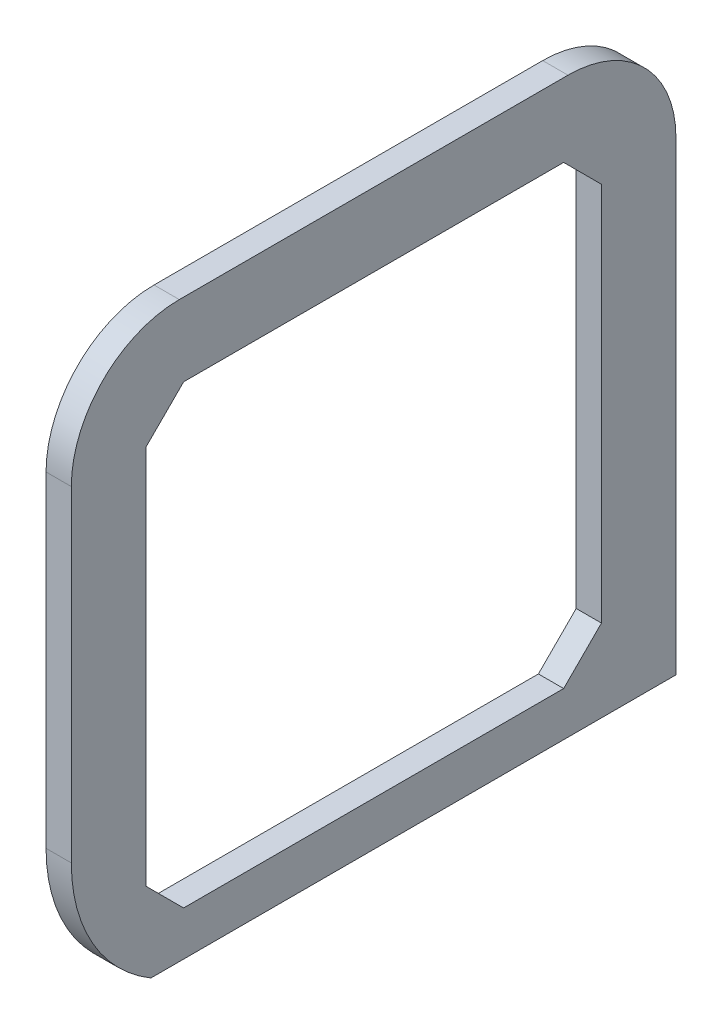
ISO-10303-21;
HEADER;
FILE_DESCRIPTION(('STEP AP214'),'2;1');
FILE_NAME('part.step','',(''),(''),'','','');
FILE_SCHEMA(('AUTOMOTIVE_DESIGN { 1 0 10303 214 1 1 1 1 }'));
ENDSEC;
DATA;
#1=APPLICATION_CONTEXT('core data for automotive mechanical design processes');
#2=APPLICATION_PROTOCOL_DEFINITION('international standard','automotive_design',2000,#1);
#3=PRODUCT_CONTEXT('',#1,'mechanical');
#4=PRODUCT('Part','Part','',(#3));
#5=PRODUCT_RELATED_PRODUCT_CATEGORY('part','',(#4));
#6=PRODUCT_DEFINITION_FORMATION('','',#4);
#7=PRODUCT_DEFINITION_CONTEXT('part definition',#1,'design');
#8=PRODUCT_DEFINITION('design','',#6,#7);
#9=PRODUCT_DEFINITION_SHAPE('','',#8);
#10=(LENGTH_UNIT() NAMED_UNIT(*) SI_UNIT(.MILLI.,.METRE.));
#11=(NAMED_UNIT(*) PLANE_ANGLE_UNIT() SI_UNIT($,.RADIAN.));
#12=(NAMED_UNIT(*) SI_UNIT($,.STERADIAN.) SOLID_ANGLE_UNIT());
#13=UNCERTAINTY_MEASURE_WITH_UNIT(LENGTH_MEASURE(1.E-05),#10,'distance_accuracy_value','');
#14=(GEOMETRIC_REPRESENTATION_CONTEXT(3) GLOBAL_UNCERTAINTY_ASSIGNED_CONTEXT((#13)) GLOBAL_UNIT_ASSIGNED_CONTEXT((#10,
#11,#12)) REPRESENTATION_CONTEXT('',''));
#15=CARTESIAN_POINT('',(0.,0.,0.));
#16=DIRECTION('',(0.,0.,1.));
#17=DIRECTION('',(1.,0.,0.));
#18=AXIS2_PLACEMENT_3D('',#15,#16,#17);
#19=CARTESIAN_POINT('',(17.7,-7.94174180000014,56.));
#20=DIRECTION('',(-1.,0.,0.));
#21=DIRECTION('',(0.,0.,1.));
#22=AXIS2_PLACEMENT_3D('',#19,#20,#21);
#23=PLANE('',#22);
#24=DIRECTION('',(0.,0.,-1.));
#25=VECTOR('',#24,1.);
#26=CARTESIAN_POINT('',(17.7,21.0200000000001,49.1));
#27=LINE('',#26,#25);
#28=CARTESIAN_POINT('',(17.7,21.0200000000001,45.6));
#29=VERTEX_POINT('',#28);
#30=CARTESIAN_POINT('',(17.7,21.0200000000001,10.4));
#31=VERTEX_POINT('',#30);
#32=EDGE_CURVE('E218',#29,#31,#27,.T.);
#33=ORIENTED_EDGE('',*,*,#32,.F.);
#34=DIRECTION('',(0.,-0.707106781186548,-0.707106781186548));
#35=VECTOR('',#34,1.);
#36=CARTESIAN_POINT('',(17.7,11.7391291,36.3191290999999));
#37=LINE('',#36,#35);
#38=CARTESIAN_POINT('',(17.7,24.5200000000001,49.1));
#39=VERTEX_POINT('',#38);
#40=EDGE_CURVE('E270',#29,#39,#37,.F.);
#41=ORIENTED_EDGE('',*,*,#40,.T.);
#42=DIRECTION('',(0.,-1.,0.));
#43=VECTOR('',#42,1.);
#44=CARTESIAN_POINT('',(17.7,21.0200000000001,49.1));
#45=LINE('',#44,#43);
#46=CARTESIAN_POINT('',(17.7,59.7200000000001,49.1));
#47=VERTEX_POINT('',#46);
#48=EDGE_CURVE('E214',#47,#39,#45,.T.);
#49=ORIENTED_EDGE('',*,*,#48,.F.);
#50=DIRECTION('',(0.,-0.707106781186548,0.707106781186548));
#51=VECTOR('',#50,1.);
#52=CARTESIAN_POINT('',(17.7,22.4391291,86.3808709000001));
#53=LINE('',#52,#51);
#54=CARTESIAN_POINT('',(17.7,63.2200000000001,45.6));
#55=VERTEX_POINT('',#54);
#56=EDGE_CURVE('E276',#47,#55,#53,.F.);
#57=ORIENTED_EDGE('',*,*,#56,.T.);
#58=DIRECTION('',(0.,0.,1.));
#59=VECTOR('',#58,1.);
#60=CARTESIAN_POINT('',(17.7,63.2200000000001,49.1));
#61=LINE('',#60,#59);
#62=CARTESIAN_POINT('',(17.7,63.2200000000001,10.4));
#63=VERTEX_POINT('',#62);
#64=EDGE_CURVE('E226',#63,#55,#61,.T.);
#65=ORIENTED_EDGE('',*,*,#64,.F.);
#66=DIRECTION('',(0.,0.707106781186547,0.707106781186548));
#67=VECTOR('',#66,1.);
#68=CARTESIAN_POINT('',(17.7,50.4391291,-2.3808709000001));
#69=LINE('',#68,#67);
#70=CARTESIAN_POINT('',(17.7,59.7200000000001,6.9));
#71=VERTEX_POINT('',#70);
#72=EDGE_CURVE('E273',#63,#71,#69,.F.);
#73=ORIENTED_EDGE('',*,*,#72,.T.);
#74=DIRECTION('',(0.,1.,0.));
#75=VECTOR('',#74,1.);
#76=CARTESIAN_POINT('',(17.7,21.0200000000001,6.89999999999999));
#77=LINE('',#76,#75);
#78=CARTESIAN_POINT('',(17.7,24.5200000000001,6.89999999999999));
#79=VERTEX_POINT('',#78);
#80=EDGE_CURVE('E222',#79,#71,#77,.T.);
#81=ORIENTED_EDGE('',*,*,#80,.F.);
#82=DIRECTION('',(0.,0.707106781186548,-0.707106781186547));
#83=VECTOR('',#82,1.);
#84=CARTESIAN_POINT('',(17.7,-16.2608709,47.6808709000001));
#85=LINE('',#84,#83);
#86=EDGE_CURVE('E267',#79,#31,#85,.F.);
#87=ORIENTED_EDGE('',*,*,#86,.T.);
#88=EDGE_LOOP('',(#33,#41,#49,#57,#65,#73,#81,#87));
#89=FACE_BOUND('',#88,.T.);
#90=CARTESIAN_POINT('',(17.7,29.8312064500954,41.));
#91=DIRECTION('',(-1.,0.,0.));
#92=DIRECTION('',(0.,0.,1.));
#93=AXIS2_PLACEMENT_3D('',#90,#91,#92);
#94=CIRCLE('',#93,15.);
#95=CARTESIAN_POINT('',(17.7,29.8312064500954,56.));
#96=VERTEX_POINT('',#95);
#97=CARTESIAN_POINT('',(17.7,16.914250509231,48.6257622059548));
#98=VERTEX_POINT('',#97);
#99=EDGE_CURVE('E303',#96,#98,#94,.F.);
#100=ORIENTED_EDGE('',*,*,#99,.T.);
#101=DIRECTION('',(0.,0.,-1.));
#102=VECTOR('',#101,1.);
#103=CARTESIAN_POINT('',(17.7,16.914250509231,56.));
#104=LINE('',#103,#102);
#105=CARTESIAN_POINT('',(17.7,16.914250509231,0.));
#106=VERTEX_POINT('',#105);
#107=EDGE_CURVE('E65',#98,#106,#104,.T.);
#108=ORIENTED_EDGE('',*,*,#107,.T.);
#109=DIRECTION('',(0.,1.,0.));
#110=VECTOR('',#109,1.);
#111=CARTESIAN_POINT('',(17.7,-7.94174180000014,0.));
#112=LINE('',#111,#110);
#113=CARTESIAN_POINT('',(17.7,60.0200000000001,0.));
#114=VERTEX_POINT('',#113);
#115=EDGE_CURVE('E168',#106,#114,#112,.T.);
#116=ORIENTED_EDGE('',*,*,#115,.T.);
#117=CARTESIAN_POINT('',(17.7,60.0200000000001,10.));
#118=DIRECTION('',(-1.,0.,0.));
#119=DIRECTION('',(0.,0.,1.));
#120=AXIS2_PLACEMENT_3D('',#117,#118,#119);
#121=CIRCLE('',#120,10.);
#122=CARTESIAN_POINT('',(17.7,70.0200000000001,10.));
#123=VERTEX_POINT('',#122);
#124=EDGE_CURVE('E286',#114,#123,#121,.F.);
#125=ORIENTED_EDGE('',*,*,#124,.T.);
#126=DIRECTION('',(0.,0.,-1.));
#127=VECTOR('',#126,1.);
#128=CARTESIAN_POINT('',(17.7,70.0200000000001,56.));
#129=LINE('',#128,#127);
#130=CARTESIAN_POINT('',(17.7,70.0200000000001,46.));
#131=VERTEX_POINT('',#130);
#132=EDGE_CURVE('E233',#131,#123,#129,.T.);
#133=ORIENTED_EDGE('',*,*,#132,.F.);
#134=CARTESIAN_POINT('',(17.7,60.0200000000001,46.));
#135=DIRECTION('',(-1.,0.,0.));
#136=DIRECTION('',(0.,0.,1.));
#137=AXIS2_PLACEMENT_3D('',#134,#135,#136);
#138=CIRCLE('',#137,10.);
#139=CARTESIAN_POINT('',(17.7,60.0200000000001,56.));
#140=VERTEX_POINT('',#139);
#141=EDGE_CURVE('E289',#131,#140,#138,.F.);
#142=ORIENTED_EDGE('',*,*,#141,.T.);
#143=DIRECTION('',(0.,1.,0.));
#144=VECTOR('',#143,1.);
#145=CARTESIAN_POINT('',(17.7,-7.94174180000014,56.));
#146=LINE('',#145,#144);
#147=EDGE_CURVE('E230',#96,#140,#146,.T.);
#148=ORIENTED_EDGE('',*,*,#147,.F.);
#149=EDGE_LOOP('',(#100,#108,#116,#125,#133,#142,#148));
#150=FACE_BOUND('',#149,.T.);
#151=ADVANCED_FACE('F41',(#89,#150),#23,.F.);
#152=CARTESIAN_POINT('',(-10.5664430952802,70.0200000000001,56.));
#153=DIRECTION('',(0.,1.,0.));
#154=DIRECTION('',(0.,0.,1.));
#155=AXIS2_PLACEMENT_3D('',#152,#153,#154);
#156=PLANE('',#155);
#157=DIRECTION('',(0.,0.,-1.));
#158=VECTOR('',#157,1.);
#159=CARTESIAN_POINT('',(15.3596974707503,70.0200000000001,56.));
#160=LINE('',#159,#158);
#161=CARTESIAN_POINT('',(15.3596974707503,70.0200000000001,46.));
#162=VERTEX_POINT('',#161);
#163=CARTESIAN_POINT('',(15.3596974707503,70.0200000000001,10.));
#164=VERTEX_POINT('',#163);
#165=EDGE_CURVE('E179',#162,#164,#160,.T.);
#166=ORIENTED_EDGE('',*,*,#165,.F.);
#167=DIRECTION('',(1.,0.,0.));
#168=VECTOR('',#167,1.);
#169=CARTESIAN_POINT('',(-10.5664430952802,70.0200000000001,46.));
#170=LINE('',#169,#168);
#171=EDGE_CURVE('E283',#162,#131,#170,.T.);
#172=ORIENTED_EDGE('',*,*,#171,.T.);
#173=ORIENTED_EDGE('',*,*,#132,.T.);
#174=DIRECTION('',(1.,0.,0.));
#175=VECTOR('',#174,1.);
#176=CARTESIAN_POINT('',(-10.5664430952802,70.0200000000001,10.));
#177=LINE('',#176,#175);
#178=EDGE_CURVE('E279',#123,#164,#177,.F.);
#179=ORIENTED_EDGE('',*,*,#178,.T.);
#180=EDGE_LOOP('',(#166,#172,#173,#179));
#181=FACE_BOUND('',#180,.T.);
#182=ADVANCED_FACE('F323',(#181),#156,.T.);
#183=CARTESIAN_POINT('',(-4.2875124071298,11.6509875928703,56.));
#184=DIRECTION('',(0.,0.,1.));
#185=DIRECTION('',(1.,0.,0.));
#186=AXIS2_PLACEMENT_3D('',#183,#184,#185);
#187=PLANE('',#186);
#188=DIRECTION('',(0.,-1.,0.));
#189=VECTOR('',#188,1.);
#190=CARTESIAN_POINT('',(15.3596974707503,72.8358012672214,56.));
#191=LINE('',#190,#189);
#192=CARTESIAN_POINT('',(15.3596974707503,60.0200000000001,56.));
#193=VERTEX_POINT('',#192);
#194=CARTESIAN_POINT('',(15.3596974707503,29.8312064500954,56.));
#195=VERTEX_POINT('',#194);
#196=EDGE_CURVE('E164',#193,#195,#191,.T.);
#197=ORIENTED_EDGE('',*,*,#196,.T.);
#198=DIRECTION('',(1.,0.,0.));
#199=VECTOR('',#198,1.);
#200=CARTESIAN_POINT('',(17.7,29.8312064500954,56.));
#201=LINE('',#200,#199);
#202=EDGE_CURVE('E300',#195,#96,#201,.T.);
#203=ORIENTED_EDGE('',*,*,#202,.T.);
#204=ORIENTED_EDGE('',*,*,#147,.T.);
#205=DIRECTION('',(1.,0.,0.));
#206=VECTOR('',#205,1.);
#207=CARTESIAN_POINT('',(-4.2875124071298,60.0200000000001,56.));
#208=LINE('',#207,#206);
#209=EDGE_CURVE('E293',#140,#193,#208,.F.);
#210=ORIENTED_EDGE('',*,*,#209,.T.);
#211=EDGE_LOOP('',(#197,#203,#204,#210));
#212=FACE_BOUND('',#211,.T.);
#213=ADVANCED_FACE('F314',(#212),#187,.T.);
#214=CARTESIAN_POINT('',(-4.2875124071298,11.6509875928703,0.));
#215=DIRECTION('',(0.,0.,1.));
#216=DIRECTION('',(1.,0.,0.));
#217=AXIS2_PLACEMENT_3D('',#214,#215,#216);
#218=PLANE('',#217);
#219=DIRECTION('',(1.,0.,0.));
#220=VECTOR('',#219,1.);
#221=CARTESIAN_POINT('',(15.3596974707503,16.914250509231,0.));
#222=LINE('',#221,#220);
#223=CARTESIAN_POINT('',(15.3596974707503,16.914250509231,0.));
#224=VERTEX_POINT('',#223);
#225=EDGE_CURVE('E160',#224,#106,#222,.T.);
#226=ORIENTED_EDGE('',*,*,#225,.F.);
#227=DIRECTION('',(0.,-1.,0.));
#228=VECTOR('',#227,1.);
#229=CARTESIAN_POINT('',(15.3596974707503,72.8358012672214,0.));
#230=LINE('',#229,#228);
#231=CARTESIAN_POINT('',(15.3596974707503,60.0200000000001,0.));
#232=VERTEX_POINT('',#231);
#233=EDGE_CURVE('E148',#232,#224,#230,.T.);
#234=ORIENTED_EDGE('',*,*,#233,.F.);
#235=DIRECTION('',(1.,0.,0.));
#236=VECTOR('',#235,1.);
#237=CARTESIAN_POINT('',(17.7,60.0200000000001,0.));
#238=LINE('',#237,#236);
#239=EDGE_CURVE('E297',#232,#114,#238,.T.);
#240=ORIENTED_EDGE('',*,*,#239,.T.);
#241=ORIENTED_EDGE('',*,*,#115,.F.);
#242=EDGE_LOOP('',(#226,#234,#240,#241));
#243=FACE_BOUND('',#242,.T.);
#244=ADVANCED_FACE('F167',(#243),#218,.F.);
#245=CARTESIAN_POINT('',(-38.3,21.0200000000001,49.1));
#246=DIRECTION('',(0.,0.,1.));
#247=DIRECTION('',(1.,0.,0.));
#248=AXIS2_PLACEMENT_3D('',#245,#246,#247);
#249=PLANE('',#248);
#250=DIRECTION('',(-1.,0.,0.));
#251=VECTOR('',#250,1.);
#252=CARTESIAN_POINT('',(-10.5664430952802,24.5200000000001,49.1));
#253=LINE('',#252,#251);
#254=CARTESIAN_POINT('',(15.3596974707503,24.5200000000001,49.1));
#255=VERTEX_POINT('',#254);
#256=EDGE_CURVE('E256',#39,#255,#253,.T.);
#257=ORIENTED_EDGE('',*,*,#256,.T.);
#258=DIRECTION('',(0.,1.,0.));
#259=VECTOR('',#258,1.);
#260=CARTESIAN_POINT('',(15.3596974707503,21.0200000000001,49.1));
#261=LINE('',#260,#259);
#262=CARTESIAN_POINT('',(15.3596974707503,59.7200000000001,49.1));
#263=VERTEX_POINT('',#262);
#264=EDGE_CURVE('E190',#255,#263,#261,.T.);
#265=ORIENTED_EDGE('',*,*,#264,.T.);
#266=DIRECTION('',(1.,0.,0.));
#267=VECTOR('',#266,1.);
#268=CARTESIAN_POINT('',(17.7,59.7200000000001,49.1));
#269=LINE('',#268,#267);
#270=EDGE_CURVE('E253',#263,#47,#269,.T.);
#271=ORIENTED_EDGE('',*,*,#270,.T.);
#272=ORIENTED_EDGE('',*,*,#48,.T.);
#273=EDGE_LOOP('',(#257,#265,#271,#272));
#274=FACE_BOUND('',#273,.T.);
#275=ADVANCED_FACE('F379',(#274),#249,.F.);
#276=CARTESIAN_POINT('',(-38.3,63.2200000000001,49.1));
#277=DIRECTION('',(0.,1.,0.));
#278=DIRECTION('',(0.,0.,1.));
#279=AXIS2_PLACEMENT_3D('',#276,#277,#278);
#280=PLANE('',#279);
#281=DIRECTION('',(-1.,0.,0.));
#282=VECTOR('',#281,1.);
#283=CARTESIAN_POINT('',(-10.5664430952802,63.2200000000001,45.6));
#284=LINE('',#283,#282);
#285=CARTESIAN_POINT('',(15.3596974707503,63.2200000000001,45.6));
#286=VERTEX_POINT('',#285);
#287=EDGE_CURVE('E260',#55,#286,#284,.T.);
#288=ORIENTED_EDGE('',*,*,#287,.T.);
#289=DIRECTION('',(0.,0.,-1.));
#290=VECTOR('',#289,1.);
#291=CARTESIAN_POINT('',(15.3596974707503,63.2200000000001,49.1));
#292=LINE('',#291,#290);
#293=CARTESIAN_POINT('',(15.3596974707503,63.2200000000001,10.4));
#294=VERTEX_POINT('',#293);
#295=EDGE_CURVE('E57',#286,#294,#292,.T.);
#296=ORIENTED_EDGE('',*,*,#295,.T.);
#297=DIRECTION('',(1.,0.,0.));
#298=VECTOR('',#297,1.);
#299=CARTESIAN_POINT('',(17.7,63.2200000000001,10.4));
#300=LINE('',#299,#298);
#301=EDGE_CURVE('E264',#294,#63,#300,.T.);
#302=ORIENTED_EDGE('',*,*,#301,.T.);
#303=ORIENTED_EDGE('',*,*,#64,.T.);
#304=EDGE_LOOP('',(#288,#296,#302,#303));
#305=FACE_BOUND('',#304,.T.);
#306=ADVANCED_FACE('F395',(#305),#280,.F.);
#307=CARTESIAN_POINT('',(-38.3,21.0200000000001,6.89999999999999));
#308=DIRECTION('',(0.,0.,-1.));
#309=DIRECTION('',(0.,1.,0.));
#310=AXIS2_PLACEMENT_3D('',#307,#308,#309);
#311=PLANE('',#310);
#312=DIRECTION('',(-1.,0.,0.));
#313=VECTOR('',#312,1.);
#314=CARTESIAN_POINT('',(-10.5664430952802,59.7200000000001,6.9));
#315=LINE('',#314,#313);
#316=CARTESIAN_POINT('',(15.3596974707503,59.7200000000001,6.9));
#317=VERTEX_POINT('',#316);
#318=EDGE_CURVE('E239',#71,#317,#315,.T.);
#319=ORIENTED_EDGE('',*,*,#318,.T.);
#320=DIRECTION('',(0.,-1.,0.));
#321=VECTOR('',#320,1.);
#322=CARTESIAN_POINT('',(15.3596974707503,21.0200000000001,6.89999999999999));
#323=LINE('',#322,#321);
#324=CARTESIAN_POINT('',(15.3596974707503,24.5200000000001,6.89999999999999));
#325=VERTEX_POINT('',#324);
#326=EDGE_CURVE('E206',#317,#325,#323,.T.);
#327=ORIENTED_EDGE('',*,*,#326,.T.);
#328=DIRECTION('',(1.,0.,0.));
#329=VECTOR('',#328,1.);
#330=CARTESIAN_POINT('',(17.7,24.5200000000001,6.89999999999999));
#331=LINE('',#330,#329);
#332=EDGE_CURVE('E243',#325,#79,#331,.T.);
#333=ORIENTED_EDGE('',*,*,#332,.T.);
#334=ORIENTED_EDGE('',*,*,#80,.T.);
#335=EDGE_LOOP('',(#319,#327,#333,#334));
#336=FACE_BOUND('',#335,.T.);
#337=ADVANCED_FACE('F389',(#336),#311,.F.);
#338=CARTESIAN_POINT('',(-38.3,21.0200000000001,49.1));
#339=DIRECTION('',(0.,-1.,0.));
#340=DIRECTION('',(0.,0.,-1.));
#341=AXIS2_PLACEMENT_3D('',#338,#339,#340);
#342=PLANE('',#341);
#343=DIRECTION('',(-1.,0.,0.));
#344=VECTOR('',#343,1.);
#345=CARTESIAN_POINT('',(-10.5664430952802,21.0200000000001,10.4));
#346=LINE('',#345,#344);
#347=CARTESIAN_POINT('',(15.3596974707503,21.0200000000001,10.4));
#348=VERTEX_POINT('',#347);
#349=EDGE_CURVE('E249',#31,#348,#346,.T.);
#350=ORIENTED_EDGE('',*,*,#349,.T.);
#351=DIRECTION('',(0.,0.,1.));
#352=VECTOR('',#351,1.);
#353=CARTESIAN_POINT('',(15.3596974707503,21.0200000000001,49.1));
#354=LINE('',#353,#352);
#355=CARTESIAN_POINT('',(15.3596974707503,21.0200000000001,45.6));
#356=VERTEX_POINT('',#355);
#357=EDGE_CURVE('E202',#348,#356,#354,.T.);
#358=ORIENTED_EDGE('',*,*,#357,.T.);
#359=DIRECTION('',(1.,0.,0.));
#360=VECTOR('',#359,1.);
#361=CARTESIAN_POINT('',(17.7,21.0200000000001,45.6));
#362=LINE('',#361,#360);
#363=EDGE_CURVE('E246',#356,#29,#362,.T.);
#364=ORIENTED_EDGE('',*,*,#363,.T.);
#365=ORIENTED_EDGE('',*,*,#32,.T.);
#366=EDGE_LOOP('',(#350,#358,#364,#365));
#367=FACE_BOUND('',#366,.T.);
#368=ADVANCED_FACE('F353',(#367),#342,.F.);
#369=CARTESIAN_POINT('',(-38.3,24.5200000000001,6.89999999999999));
#370=DIRECTION('',(0.,0.707106781186547,0.707106781186548));
#371=DIRECTION('',(-1.,0.,0.));
#372=AXIS2_PLACEMENT_3D('',#369,#370,#371);
#373=PLANE('',#372);
#374=ORIENTED_EDGE('',*,*,#332,.F.);
#375=DIRECTION('',(0.,0.707106781186548,-0.707106781186547));
#376=VECTOR('',#375,1.);
#377=CARTESIAN_POINT('',(15.3596974707503,24.5200000000001,6.89999999999999));
#378=LINE('',#377,#376);
#379=EDGE_CURVE('E210',#325,#348,#378,.F.);
#380=ORIENTED_EDGE('',*,*,#379,.T.);
#381=ORIENTED_EDGE('',*,*,#349,.F.);
#382=ORIENTED_EDGE('',*,*,#86,.F.);
#383=EDGE_LOOP('',(#374,#380,#381,#382));
#384=FACE_BOUND('',#383,.T.);
#385=ADVANCED_FACE('F346',(#384),#373,.T.);
#386=CARTESIAN_POINT('',(-38.3,21.0200000000001,45.6));
#387=DIRECTION('',(0.,0.707106781186547,-0.707106781186547));
#388=DIRECTION('',(-1.,0.,0.));
#389=AXIS2_PLACEMENT_3D('',#386,#387,#388);
#390=PLANE('',#389);
#391=ORIENTED_EDGE('',*,*,#363,.F.);
#392=DIRECTION('',(0.,-0.707106781186548,-0.707106781186548));
#393=VECTOR('',#392,1.);
#394=CARTESIAN_POINT('',(15.3596974707503,21.0200000000001,45.6));
#395=LINE('',#394,#393);
#396=EDGE_CURVE('E198',#356,#255,#395,.F.);
#397=ORIENTED_EDGE('',*,*,#396,.T.);
#398=ORIENTED_EDGE('',*,*,#256,.F.);
#399=ORIENTED_EDGE('',*,*,#40,.F.);
#400=EDGE_LOOP('',(#391,#397,#398,#399));
#401=FACE_BOUND('',#400,.T.);
#402=ADVANCED_FACE('F352',(#401),#390,.T.);
#403=CARTESIAN_POINT('',(-38.3,63.2200000000001,10.4));
#404=DIRECTION('',(0.,-0.707106781186548,0.707106781186547));
#405=DIRECTION('',(-1.,0.,0.));
#406=AXIS2_PLACEMENT_3D('',#403,#404,#405);
#407=PLANE('',#406);
#408=ORIENTED_EDGE('',*,*,#301,.F.);
#409=DIRECTION('',(0.,0.707106781186547,0.707106781186548));
#410=VECTOR('',#409,1.);
#411=CARTESIAN_POINT('',(15.3596974707503,63.2200000000001,10.4));
#412=LINE('',#411,#410);
#413=EDGE_CURVE('E194',#294,#317,#412,.F.);
#414=ORIENTED_EDGE('',*,*,#413,.T.);
#415=ORIENTED_EDGE('',*,*,#318,.F.);
#416=ORIENTED_EDGE('',*,*,#72,.F.);
#417=EDGE_LOOP('',(#408,#414,#415,#416));
#418=FACE_BOUND('',#417,.T.);
#419=ADVANCED_FACE('F360',(#418),#407,.T.);
#420=CARTESIAN_POINT('',(-38.3,59.7200000000001,49.1));
#421=DIRECTION('',(0.,-0.707106781186547,-0.707106781186547));
#422=DIRECTION('',(-1.,0.,0.));
#423=AXIS2_PLACEMENT_3D('',#420,#421,#422);
#424=PLANE('',#423);
#425=ORIENTED_EDGE('',*,*,#270,.F.);
#426=DIRECTION('',(0.,-0.707106781186548,0.707106781186548));
#427=VECTOR('',#426,1.);
#428=CARTESIAN_POINT('',(15.3596974707503,59.7200000000001,49.1));
#429=LINE('',#428,#427);
#430=EDGE_CURVE('E185',#263,#286,#429,.F.);
#431=ORIENTED_EDGE('',*,*,#430,.T.);
#432=ORIENTED_EDGE('',*,*,#287,.F.);
#433=ORIENTED_EDGE('',*,*,#56,.F.);
#434=EDGE_LOOP('',(#425,#431,#432,#433));
#435=FACE_BOUND('',#434,.T.);
#436=ADVANCED_FACE('F333',(#435),#424,.T.);
#437=CARTESIAN_POINT('',(-10.5664430952802,60.0200000000001,46.));
#438=DIRECTION('',(1.,0.,0.));
#439=DIRECTION('',(0.,0.,-1.));
#440=AXIS2_PLACEMENT_3D('',#437,#438,#439);
#441=CYLINDRICAL_SURFACE('',#440,10.);
#442=CARTESIAN_POINT('',(15.3596974707503,60.0200000000001,46.));
#443=DIRECTION('',(1.,0.,0.));
#444=DIRECTION('',(0.,0.,-1.));
#445=AXIS2_PLACEMENT_3D('',#442,#443,#444);
#446=CIRCLE('',#445,10.);
#447=EDGE_CURVE('E182',#193,#162,#446,.F.);
#448=ORIENTED_EDGE('',*,*,#447,.F.);
#449=ORIENTED_EDGE('',*,*,#209,.F.);
#450=ORIENTED_EDGE('',*,*,#141,.F.);
#451=ORIENTED_EDGE('',*,*,#171,.F.);
#452=EDGE_LOOP('',(#448,#449,#450,#451));
#453=FACE_BOUND('',#452,.T.);
#454=ADVANCED_FACE('F318',(#453),#441,.T.);
#455=CARTESIAN_POINT('',(-4.2875124071298,60.0200000000001,10.));
#456=DIRECTION('',(-1.,0.,0.));
#457=DIRECTION('',(0.,0.,1.));
#458=AXIS2_PLACEMENT_3D('',#455,#456,#457);
#459=CYLINDRICAL_SURFACE('',#458,10.);
#460=CARTESIAN_POINT('',(15.3596974707503,60.0200000000001,10.));
#461=DIRECTION('',(1.,0.,0.));
#462=DIRECTION('',(0.,0.,-1.));
#463=AXIS2_PLACEMENT_3D('',#460,#461,#462);
#464=CIRCLE('',#463,10.);
#465=EDGE_CURVE('E154',#164,#232,#464,.F.);
#466=ORIENTED_EDGE('',*,*,#465,.F.);
#467=ORIENTED_EDGE('',*,*,#178,.F.);
#468=ORIENTED_EDGE('',*,*,#124,.F.);
#469=ORIENTED_EDGE('',*,*,#239,.F.);
#470=EDGE_LOOP('',(#466,#467,#468,#469));
#471=FACE_BOUND('',#470,.T.);
#472=ADVANCED_FACE('F327',(#471),#459,.T.);
#473=CARTESIAN_POINT('',(-10.5664430952802,29.8312064500954,41.));
#474=DIRECTION('',(-1.,0.,0.));
#475=DIRECTION('',(0.,0.,1.));
#476=AXIS2_PLACEMENT_3D('',#473,#474,#475);
#477=CYLINDRICAL_SURFACE('',#476,15.);
#478=CARTESIAN_POINT('',(15.3596974707503,29.8312064500954,41.));
#479=DIRECTION('',(1.,0.,0.));
#480=DIRECTION('',(0.,0.,-1.));
#481=AXIS2_PLACEMENT_3D('',#478,#479,#480);
#482=CIRCLE('',#481,15.);
#483=CARTESIAN_POINT('',(15.3596974707503,16.914250509231,48.6257622059548));
#484=VERTEX_POINT('',#483);
#485=EDGE_CURVE('E11',#484,#195,#482,.F.);
#486=ORIENTED_EDGE('',*,*,#485,.F.);
#487=DIRECTION('',(-1.,0.,0.));
#488=VECTOR('',#487,1.);
#489=CARTESIAN_POINT('',(-10.5664430952802,16.914250509231,48.6257622059548));
#490=LINE('',#489,#488);
#491=EDGE_CURVE('E50',#98,#484,#490,.T.);
#492=ORIENTED_EDGE('',*,*,#491,.F.);
#493=ORIENTED_EDGE('',*,*,#99,.F.);
#494=ORIENTED_EDGE('',*,*,#202,.F.);
#495=EDGE_LOOP('',(#486,#492,#493,#494));
#496=FACE_BOUND('',#495,.T.);
#497=ADVANCED_FACE('F43',(#496),#477,.T.);
#498=CARTESIAN_POINT('',(15.3596974707503,72.8358012672214,56.));
#499=DIRECTION('',(1.,0.,0.));
#500=DIRECTION('',(0.,0.,-1.));
#501=AXIS2_PLACEMENT_3D('',#498,#499,#500);
#502=PLANE('',#501);
#503=ORIENTED_EDGE('',*,*,#447,.T.);
#504=ORIENTED_EDGE('',*,*,#165,.T.);
#505=ORIENTED_EDGE('',*,*,#465,.T.);
#506=ORIENTED_EDGE('',*,*,#233,.T.);
#507=DIRECTION('',(0.,0.,-1.));
#508=VECTOR('',#507,1.);
#509=CARTESIAN_POINT('',(15.3596974707503,16.914250509231,56.));
#510=LINE('',#509,#508);
#511=EDGE_CURVE('E151',#484,#224,#510,.T.);
#512=ORIENTED_EDGE('',*,*,#511,.F.);
#513=ORIENTED_EDGE('',*,*,#485,.T.);
#514=ORIENTED_EDGE('',*,*,#196,.F.);
#515=EDGE_LOOP('',(#503,#504,#505,#506,#512,#513,#514));
#516=FACE_BOUND('',#515,.T.);
#517=ORIENTED_EDGE('',*,*,#326,.F.);
#518=ORIENTED_EDGE('',*,*,#413,.F.);
#519=ORIENTED_EDGE('',*,*,#295,.F.);
#520=ORIENTED_EDGE('',*,*,#430,.F.);
#521=ORIENTED_EDGE('',*,*,#264,.F.);
#522=ORIENTED_EDGE('',*,*,#396,.F.);
#523=ORIENTED_EDGE('',*,*,#357,.F.);
#524=ORIENTED_EDGE('',*,*,#379,.F.);
#525=EDGE_LOOP('',(#517,#518,#519,#520,#521,#522,#523,#524));
#526=FACE_BOUND('',#525,.T.);
#527=ADVANCED_FACE('F150',(#516,#526),#502,.F.);
#528=CARTESIAN_POINT('',(15.3596974707503,16.914250509231,56.));
#529=DIRECTION('',(0.,1.,0.));
#530=DIRECTION('',(0.,0.,1.));
#531=AXIS2_PLACEMENT_3D('',#528,#529,#530);
#532=PLANE('',#531);
#533=ORIENTED_EDGE('',*,*,#491,.T.);
#534=ORIENTED_EDGE('',*,*,#511,.T.);
#535=ORIENTED_EDGE('',*,*,#225,.T.);
#536=ORIENTED_EDGE('',*,*,#107,.F.);
#537=EDGE_LOOP('',(#533,#534,#535,#536));
#538=FACE_BOUND('',#537,.T.);
#539=ADVANCED_FACE('F162',(#538),#532,.F.);
#540=CLOSED_SHELL('',(#151,#182,#213,#244,#275,#306,#337,#368,#385,#402,#419,#436,#454,#472,
#497,#527,#539));
#541=MANIFOLD_SOLID_BREP('B2',#540);
#542=ADVANCED_BREP_SHAPE_REPRESENTATION('',(#18,#541),#14);
#543=SHAPE_DEFINITION_REPRESENTATION(#9,#542);
ENDSEC;
END-ISO-10303-21;
